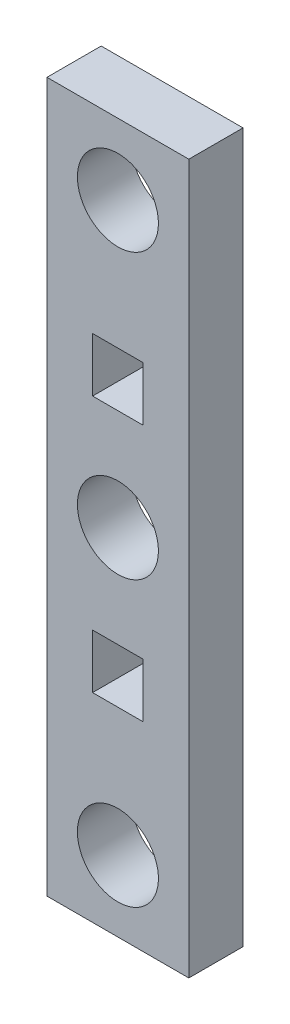
ISO-10303-21;
HEADER;
FILE_DESCRIPTION(('STEP AP214'),'2;1');
FILE_NAME('part.step','',(''),(''),'','','');
FILE_SCHEMA(('AUTOMOTIVE_DESIGN { 1 0 10303 214 1 1 1 1 }'));
ENDSEC;
DATA;
#1=APPLICATION_CONTEXT('core data for automotive mechanical design processes');
#2=APPLICATION_PROTOCOL_DEFINITION('international standard','automotive_design',2000,#1);
#3=PRODUCT_CONTEXT('',#1,'mechanical');
#4=PRODUCT('Part','Part','',(#3));
#5=PRODUCT_RELATED_PRODUCT_CATEGORY('part','',(#4));
#6=PRODUCT_DEFINITION_FORMATION('','',#4);
#7=PRODUCT_DEFINITION_CONTEXT('part definition',#1,'design');
#8=PRODUCT_DEFINITION('design','',#6,#7);
#9=PRODUCT_DEFINITION_SHAPE('','',#8);
#10=(LENGTH_UNIT() NAMED_UNIT(*) SI_UNIT(.MILLI.,.METRE.));
#11=(NAMED_UNIT(*) PLANE_ANGLE_UNIT() SI_UNIT($,.RADIAN.));
#12=(NAMED_UNIT(*) SI_UNIT($,.STERADIAN.) SOLID_ANGLE_UNIT());
#13=UNCERTAINTY_MEASURE_WITH_UNIT(LENGTH_MEASURE(1.E-05),#10,'distance_accuracy_value','');
#14=(GEOMETRIC_REPRESENTATION_CONTEXT(3) GLOBAL_UNCERTAINTY_ASSIGNED_CONTEXT((#13)) GLOBAL_UNIT_ASSIGNED_CONTEXT((#10,
#11,#12)) REPRESENTATION_CONTEXT('',''));
#15=CARTESIAN_POINT('',(0.,0.,0.));
#16=DIRECTION('',(0.,0.,1.));
#17=DIRECTION('',(1.,0.,0.));
#18=AXIS2_PLACEMENT_3D('',#15,#16,#17);
#19=CARTESIAN_POINT('',(0.,0.,5.35));
#20=DIRECTION('',(0.,0.,-1.));
#21=DIRECTION('',(-1.,0.,0.));
#22=AXIS2_PLACEMENT_3D('',#19,#20,#21);
#23=PLANE('',#22);
#24=DIRECTION('',(0.,1.,0.));
#25=VECTOR('',#24,1.);
#26=CARTESIAN_POINT('',(9.5,45.,5.35));
#27=LINE('',#26,#25);
#28=CARTESIAN_POINT('',(9.5,45.,5.35));
#29=VERTEX_POINT('',#28);
#30=CARTESIAN_POINT('',(9.5,50.35,5.35));
#31=VERTEX_POINT('',#30);
#32=EDGE_CURVE('E160',#29,#31,#27,.T.);
#33=ORIENTED_EDGE('',*,*,#32,.F.);
#34=DIRECTION('',(1.,0.,0.));
#35=VECTOR('',#34,1.);
#36=CARTESIAN_POINT('',(4.5,45.,5.35));
#37=LINE('',#36,#35);
#38=CARTESIAN_POINT('',(4.5,45.,5.35));
#39=VERTEX_POINT('',#38);
#40=EDGE_CURVE('E168',#39,#29,#37,.T.);
#41=ORIENTED_EDGE('',*,*,#40,.F.);
#42=DIRECTION('',(0.,-1.,0.));
#43=VECTOR('',#42,1.);
#44=CARTESIAN_POINT('',(4.5,45.,5.35));
#45=LINE('',#44,#43);
#46=CARTESIAN_POINT('',(4.5,50.35,5.35));
#47=VERTEX_POINT('',#46);
#48=EDGE_CURVE('E165',#47,#39,#45,.T.);
#49=ORIENTED_EDGE('',*,*,#48,.F.);
#50=DIRECTION('',(-1.,0.,0.));
#51=VECTOR('',#50,1.);
#52=CARTESIAN_POINT('',(4.5,50.35,5.35));
#53=LINE('',#52,#51);
#54=EDGE_CURVE('E162',#31,#47,#53,.T.);
#55=ORIENTED_EDGE('',*,*,#54,.F.);
#56=EDGE_LOOP('',(#33,#41,#49,#55));
#57=FACE_BOUND('',#56,.T.);
#58=DIRECTION('',(0.,-1.,0.));
#59=VECTOR('',#58,1.);
#60=CARTESIAN_POINT('',(0.,0.,5.35));
#61=LINE('',#60,#59);
#62=CARTESIAN_POINT('',(0.,70.,5.35));
#63=VERTEX_POINT('',#62);
#64=CARTESIAN_POINT('',(0.,0.,5.35));
#65=VERTEX_POINT('',#64);
#66=EDGE_CURVE('E197',#63,#65,#61,.T.);
#67=ORIENTED_EDGE('',*,*,#66,.T.);
#68=DIRECTION('',(1.,0.,0.));
#69=VECTOR('',#68,1.);
#70=CARTESIAN_POINT('',(0.,0.,5.35));
#71=LINE('',#70,#69);
#72=CARTESIAN_POINT('',(14.,0.,5.35));
#73=VERTEX_POINT('',#72);
#74=EDGE_CURVE('E200',#65,#73,#71,.T.);
#75=ORIENTED_EDGE('',*,*,#74,.T.);
#76=DIRECTION('',(0.,1.,0.));
#77=VECTOR('',#76,1.);
#78=CARTESIAN_POINT('',(14.,0.,5.35));
#79=LINE('',#78,#77);
#80=CARTESIAN_POINT('',(14.,70.,5.35));
#81=VERTEX_POINT('',#80);
#82=EDGE_CURVE('E203',#73,#81,#79,.T.);
#83=ORIENTED_EDGE('',*,*,#82,.T.);
#84=DIRECTION('',(-1.,0.,0.));
#85=VECTOR('',#84,1.);
#86=CARTESIAN_POINT('',(0.,70.,5.35));
#87=LINE('',#86,#85);
#88=EDGE_CURVE('E205',#81,#63,#87,.T.);
#89=ORIENTED_EDGE('',*,*,#88,.T.);
#90=EDGE_LOOP('',(#67,#75,#83,#89));
#91=FACE_BOUND('',#90,.T.);
#92=CARTESIAN_POINT('',(7.,63.,5.35));
#93=DIRECTION('',(0.,0.,1.));
#94=DIRECTION('',(1.,0.,0.));
#95=AXIS2_PLACEMENT_3D('',#92,#93,#94);
#96=CIRCLE('',#95,4.);
#97=CARTESIAN_POINT('',(11.,63.,5.35));
#98=VERTEX_POINT('',#97);
#99=EDGE_CURVE('E191',#98,#98,#96,.T.);
#100=ORIENTED_EDGE('',*,*,#99,.F.);
#101=EDGE_LOOP('',(#100));
#102=FACE_BOUND('',#101,.T.);
#103=DIRECTION('',(0.,-1.,0.));
#104=VECTOR('',#103,1.);
#105=CARTESIAN_POINT('',(4.5,25.,5.35));
#106=LINE('',#105,#104);
#107=CARTESIAN_POINT('',(4.5,25.,5.35));
#108=VERTEX_POINT('',#107);
#109=CARTESIAN_POINT('',(4.5,19.65,5.35));
#110=VERTEX_POINT('',#109);
#111=EDGE_CURVE('E121',#108,#110,#106,.T.);
#112=ORIENTED_EDGE('',*,*,#111,.F.);
#113=DIRECTION('',(-1.,0.,0.));
#114=VECTOR('',#113,1.);
#115=CARTESIAN_POINT('',(4.5,25.,5.35));
#116=LINE('',#115,#114);
#117=CARTESIAN_POINT('',(9.5,25.,5.35));
#118=VERTEX_POINT('',#117);
#119=EDGE_CURVE('E144',#118,#108,#116,.T.);
#120=ORIENTED_EDGE('',*,*,#119,.F.);
#121=DIRECTION('',(0.,1.,0.));
#122=VECTOR('',#121,1.);
#123=CARTESIAN_POINT('',(9.5,25.,5.35));
#124=LINE('',#123,#122);
#125=CARTESIAN_POINT('',(9.5,19.65,5.35));
#126=VERTEX_POINT('',#125);
#127=EDGE_CURVE('E142',#126,#118,#124,.T.);
#128=ORIENTED_EDGE('',*,*,#127,.F.);
#129=DIRECTION('',(1.,0.,0.));
#130=VECTOR('',#129,1.);
#131=CARTESIAN_POINT('',(4.5,19.65,5.35));
#132=LINE('',#131,#130);
#133=EDGE_CURVE('E129',#110,#126,#132,.T.);
#134=ORIENTED_EDGE('',*,*,#133,.F.);
#135=EDGE_LOOP('',(#112,#120,#128,#134));
#136=FACE_BOUND('',#135,.T.);
#137=CARTESIAN_POINT('',(7.,7.00000000000001,5.35));
#138=DIRECTION('',(0.,0.,1.));
#139=DIRECTION('',(-1.,0.,0.));
#140=AXIS2_PLACEMENT_3D('',#137,#138,#139);
#141=CIRCLE('',#140,4.);
#142=CARTESIAN_POINT('',(3.,7.00000000000001,5.35));
#143=VERTEX_POINT('',#142);
#144=EDGE_CURVE('E150',#143,#143,#141,.T.);
#145=ORIENTED_EDGE('',*,*,#144,.F.);
#146=EDGE_LOOP('',(#145));
#147=FACE_BOUND('',#146,.T.);
#148=CARTESIAN_POINT('',(7.,35.,5.35));
#149=DIRECTION('',(0.,0.,1.));
#150=DIRECTION('',(1.,0.,0.));
#151=AXIS2_PLACEMENT_3D('',#148,#149,#150);
#152=CIRCLE('',#151,4.);
#153=CARTESIAN_POINT('',(11.,35.,5.35));
#154=VERTEX_POINT('',#153);
#155=EDGE_CURVE('E283',#154,#154,#152,.T.);
#156=ORIENTED_EDGE('',*,*,#155,.F.);
#157=EDGE_LOOP('',(#156));
#158=FACE_BOUND('',#157,.T.);
#159=ADVANCED_FACE('F32',(#57,#91,#102,#136,#147,#158),#23,.F.);
#160=CARTESIAN_POINT('',(0.,0.,0.));
#161=DIRECTION('',(0.,0.,-1.));
#162=DIRECTION('',(-1.,0.,0.));
#163=AXIS2_PLACEMENT_3D('',#160,#161,#162);
#164=PLANE('',#163);
#165=CARTESIAN_POINT('',(7.,7.00000000000001,0.));
#166=DIRECTION('',(0.,0.,1.));
#167=DIRECTION('',(-1.,0.,0.));
#168=AXIS2_PLACEMENT_3D('',#165,#166,#167);
#169=CIRCLE('',#168,4.);
#170=CARTESIAN_POINT('',(3.,7.00000000000001,0.));
#171=VERTEX_POINT('',#170);
#172=EDGE_CURVE('E286',#171,#171,#169,.T.);
#173=ORIENTED_EDGE('',*,*,#172,.T.);
#174=EDGE_LOOP('',(#173));
#175=FACE_BOUND('',#174,.T.);
#176=DIRECTION('',(0.,-1.,0.));
#177=VECTOR('',#176,1.);
#178=CARTESIAN_POINT('',(0.,0.,0.));
#179=LINE('',#178,#177);
#180=CARTESIAN_POINT('',(0.,70.,0.));
#181=VERTEX_POINT('',#180);
#182=CARTESIAN_POINT('',(0.,0.,0.));
#183=VERTEX_POINT('',#182);
#184=EDGE_CURVE('E194',#181,#183,#179,.T.);
#185=ORIENTED_EDGE('',*,*,#184,.F.);
#186=DIRECTION('',(-1.,0.,0.));
#187=VECTOR('',#186,1.);
#188=CARTESIAN_POINT('',(0.,70.,0.));
#189=LINE('',#188,#187);
#190=CARTESIAN_POINT('',(14.,70.,0.));
#191=VERTEX_POINT('',#190);
#192=EDGE_CURVE('E201',#191,#181,#189,.T.);
#193=ORIENTED_EDGE('',*,*,#192,.F.);
#194=DIRECTION('',(0.,1.,0.));
#195=VECTOR('',#194,1.);
#196=CARTESIAN_POINT('',(14.,0.,0.));
#197=LINE('',#196,#195);
#198=CARTESIAN_POINT('',(14.,0.,0.));
#199=VERTEX_POINT('',#198);
#200=EDGE_CURVE('E212',#199,#191,#197,.T.);
#201=ORIENTED_EDGE('',*,*,#200,.F.);
#202=DIRECTION('',(1.,0.,0.));
#203=VECTOR('',#202,1.);
#204=CARTESIAN_POINT('',(0.,0.,0.));
#205=LINE('',#204,#203);
#206=EDGE_CURVE('E210',#183,#199,#205,.T.);
#207=ORIENTED_EDGE('',*,*,#206,.F.);
#208=EDGE_LOOP('',(#185,#193,#201,#207));
#209=FACE_BOUND('',#208,.T.);
#210=CARTESIAN_POINT('',(7.,63.,0.));
#211=DIRECTION('',(0.,0.,1.));
#212=DIRECTION('',(1.,0.,0.));
#213=AXIS2_PLACEMENT_3D('',#210,#211,#212);
#214=CIRCLE('',#213,4.);
#215=CARTESIAN_POINT('',(11.,63.,0.));
#216=VERTEX_POINT('',#215);
#217=EDGE_CURVE('E190',#216,#216,#214,.T.);
#218=ORIENTED_EDGE('',*,*,#217,.T.);
#219=EDGE_LOOP('',(#218));
#220=FACE_BOUND('',#219,.T.);
#221=DIRECTION('',(1.,0.,0.));
#222=VECTOR('',#221,1.);
#223=CARTESIAN_POINT('',(4.5,45.,0.));
#224=LINE('',#223,#222);
#225=CARTESIAN_POINT('',(4.5,45.,0.));
#226=VERTEX_POINT('',#225);
#227=CARTESIAN_POINT('',(9.5,45.,0.));
#228=VERTEX_POINT('',#227);
#229=EDGE_CURVE('E163',#226,#228,#224,.T.);
#230=ORIENTED_EDGE('',*,*,#229,.T.);
#231=DIRECTION('',(0.,1.,0.));
#232=VECTOR('',#231,1.);
#233=CARTESIAN_POINT('',(9.5,45.,0.));
#234=LINE('',#233,#232);
#235=CARTESIAN_POINT('',(9.5,50.35,0.));
#236=VERTEX_POINT('',#235);
#237=EDGE_CURVE('E137',#228,#236,#234,.T.);
#238=ORIENTED_EDGE('',*,*,#237,.T.);
#239=DIRECTION('',(-1.,0.,0.));
#240=VECTOR('',#239,1.);
#241=CARTESIAN_POINT('',(4.5,50.35,0.));
#242=LINE('',#241,#240);
#243=CARTESIAN_POINT('',(4.5,50.35,0.));
#244=VERTEX_POINT('',#243);
#245=EDGE_CURVE('E173',#236,#244,#242,.T.);
#246=ORIENTED_EDGE('',*,*,#245,.T.);
#247=DIRECTION('',(0.,-1.,0.));
#248=VECTOR('',#247,1.);
#249=CARTESIAN_POINT('',(4.5,45.,0.));
#250=LINE('',#249,#248);
#251=EDGE_CURVE('E176',#244,#226,#250,.T.);
#252=ORIENTED_EDGE('',*,*,#251,.T.);
#253=EDGE_LOOP('',(#230,#238,#246,#252));
#254=FACE_BOUND('',#253,.T.);
#255=DIRECTION('',(-1.,0.,0.));
#256=VECTOR('',#255,1.);
#257=CARTESIAN_POINT('',(4.5,25.,0.));
#258=LINE('',#257,#256);
#259=CARTESIAN_POINT('',(9.5,25.,0.));
#260=VERTEX_POINT('',#259);
#261=CARTESIAN_POINT('',(4.5,25.,0.));
#262=VERTEX_POINT('',#261);
#263=EDGE_CURVE('E130',#260,#262,#258,.T.);
#264=ORIENTED_EDGE('',*,*,#263,.T.);
#265=DIRECTION('',(0.,-1.,0.));
#266=VECTOR('',#265,1.);
#267=CARTESIAN_POINT('',(4.5,25.,0.));
#268=LINE('',#267,#266);
#269=CARTESIAN_POINT('',(4.5,19.65,0.));
#270=VERTEX_POINT('',#269);
#271=EDGE_CURVE('E55',#262,#270,#268,.T.);
#272=ORIENTED_EDGE('',*,*,#271,.T.);
#273=DIRECTION('',(1.,0.,0.));
#274=VECTOR('',#273,1.);
#275=CARTESIAN_POINT('',(4.5,19.65,0.));
#276=LINE('',#275,#274);
#277=CARTESIAN_POINT('',(9.5,19.65,0.));
#278=VERTEX_POINT('',#277);
#279=EDGE_CURVE('E136',#270,#278,#276,.T.);
#280=ORIENTED_EDGE('',*,*,#279,.T.);
#281=DIRECTION('',(0.,1.,0.));
#282=VECTOR('',#281,1.);
#283=CARTESIAN_POINT('',(9.5,25.,0.));
#284=LINE('',#283,#282);
#285=EDGE_CURVE('E152',#278,#260,#284,.T.);
#286=ORIENTED_EDGE('',*,*,#285,.T.);
#287=EDGE_LOOP('',(#264,#272,#280,#286));
#288=FACE_BOUND('',#287,.T.);
#289=CARTESIAN_POINT('',(7.,35.,0.));
#290=DIRECTION('',(0.,0.,1.));
#291=DIRECTION('',(1.,0.,0.));
#292=AXIS2_PLACEMENT_3D('',#289,#290,#291);
#293=CIRCLE('',#292,4.);
#294=CARTESIAN_POINT('',(11.,35.,0.));
#295=VERTEX_POINT('',#294);
#296=EDGE_CURVE('E281',#295,#295,#293,.T.);
#297=ORIENTED_EDGE('',*,*,#296,.T.);
#298=EDGE_LOOP('',(#297));
#299=FACE_BOUND('',#298,.T.);
#300=ADVANCED_FACE('F230',(#175,#209,#220,#254,#288,#299),#164,.T.);
#301=CARTESIAN_POINT('',(0.,0.,5.35));
#302=DIRECTION('',(1.,0.,0.));
#303=DIRECTION('',(0.,0.,-1.));
#304=AXIS2_PLACEMENT_3D('',#301,#302,#303);
#305=PLANE('',#304);
#306=ORIENTED_EDGE('',*,*,#184,.T.);
#307=DIRECTION('',(0.,0.,-1.));
#308=VECTOR('',#307,1.);
#309=CARTESIAN_POINT('',(0.,0.,5.35));
#310=LINE('',#309,#308);
#311=EDGE_CURVE('E11',#65,#183,#310,.T.);
#312=ORIENTED_EDGE('',*,*,#311,.F.);
#313=ORIENTED_EDGE('',*,*,#66,.F.);
#314=DIRECTION('',(0.,0.,-1.));
#315=VECTOR('',#314,1.);
#316=CARTESIAN_POINT('',(0.,70.,5.35));
#317=LINE('',#316,#315);
#318=EDGE_CURVE('E207',#63,#181,#317,.T.);
#319=ORIENTED_EDGE('',*,*,#318,.T.);
#320=EDGE_LOOP('',(#306,#312,#313,#319));
#321=FACE_BOUND('',#320,.T.);
#322=ADVANCED_FACE('F34',(#321),#305,.F.);
#323=CARTESIAN_POINT('',(0.,0.,5.35));
#324=DIRECTION('',(0.,1.,0.));
#325=DIRECTION('',(0.,0.,1.));
#326=AXIS2_PLACEMENT_3D('',#323,#324,#325);
#327=PLANE('',#326);
#328=ORIENTED_EDGE('',*,*,#206,.T.);
#329=DIRECTION('',(0.,0.,-1.));
#330=VECTOR('',#329,1.);
#331=CARTESIAN_POINT('',(14.,0.,5.35));
#332=LINE('',#331,#330);
#333=EDGE_CURVE('E40',#73,#199,#332,.T.);
#334=ORIENTED_EDGE('',*,*,#333,.F.);
#335=ORIENTED_EDGE('',*,*,#74,.F.);
#336=ORIENTED_EDGE('',*,*,#311,.T.);
#337=EDGE_LOOP('',(#328,#334,#335,#336));
#338=FACE_BOUND('',#337,.T.);
#339=ADVANCED_FACE('F241',(#338),#327,.F.);
#340=CARTESIAN_POINT('',(14.,0.,5.35));
#341=DIRECTION('',(-1.,0.,0.));
#342=DIRECTION('',(0.,-1.,0.));
#343=AXIS2_PLACEMENT_3D('',#340,#341,#342);
#344=PLANE('',#343);
#345=ORIENTED_EDGE('',*,*,#200,.T.);
#346=DIRECTION('',(0.,0.,-1.));
#347=VECTOR('',#346,1.);
#348=CARTESIAN_POINT('',(14.,70.,5.35));
#349=LINE('',#348,#347);
#350=EDGE_CURVE('E217',#81,#191,#349,.T.);
#351=ORIENTED_EDGE('',*,*,#350,.F.);
#352=ORIENTED_EDGE('',*,*,#82,.F.);
#353=ORIENTED_EDGE('',*,*,#333,.T.);
#354=EDGE_LOOP('',(#345,#351,#352,#353));
#355=FACE_BOUND('',#354,.T.);
#356=ADVANCED_FACE('F224',(#355),#344,.F.);
#357=CARTESIAN_POINT('',(0.,70.,5.35));
#358=DIRECTION('',(0.,-1.,0.));
#359=DIRECTION('',(0.,0.,-1.));
#360=AXIS2_PLACEMENT_3D('',#357,#358,#359);
#361=PLANE('',#360);
#362=ORIENTED_EDGE('',*,*,#192,.T.);
#363=ORIENTED_EDGE('',*,*,#318,.F.);
#364=ORIENTED_EDGE('',*,*,#88,.F.);
#365=ORIENTED_EDGE('',*,*,#350,.T.);
#366=EDGE_LOOP('',(#362,#363,#364,#365));
#367=FACE_BOUND('',#366,.T.);
#368=ADVANCED_FACE('F234',(#367),#361,.F.);
#369=CARTESIAN_POINT('',(7.,63.,5.35));
#370=DIRECTION('',(0.,0.,-1.));
#371=DIRECTION('',(-1.,0.,0.));
#372=AXIS2_PLACEMENT_3D('',#369,#370,#371);
#373=CYLINDRICAL_SURFACE('',#372,4.);
#374=ORIENTED_EDGE('',*,*,#99,.T.);
#375=EDGE_LOOP('',(#374));
#376=FACE_BOUND('',#375,.T.);
#377=ORIENTED_EDGE('',*,*,#217,.F.);
#378=EDGE_LOOP('',(#377));
#379=FACE_BOUND('',#378,.T.);
#380=ADVANCED_FACE('F258',(#376,#379),#373,.F.);
#381=CARTESIAN_POINT('',(9.5,45.,5.35));
#382=DIRECTION('',(-1.,0.,0.));
#383=DIRECTION('',(0.,0.,1.));
#384=AXIS2_PLACEMENT_3D('',#381,#382,#383);
#385=PLANE('',#384);
#386=ORIENTED_EDGE('',*,*,#237,.F.);
#387=DIRECTION('',(0.,0.,-1.));
#388=VECTOR('',#387,1.);
#389=CARTESIAN_POINT('',(9.5,45.,5.35));
#390=LINE('',#389,#388);
#391=EDGE_CURVE('E170',#29,#228,#390,.T.);
#392=ORIENTED_EDGE('',*,*,#391,.F.);
#393=ORIENTED_EDGE('',*,*,#32,.T.);
#394=DIRECTION('',(0.,0.,-1.));
#395=VECTOR('',#394,1.);
#396=CARTESIAN_POINT('',(9.5,50.35,5.35));
#397=LINE('',#396,#395);
#398=EDGE_CURVE('E187',#31,#236,#397,.T.);
#399=ORIENTED_EDGE('',*,*,#398,.T.);
#400=EDGE_LOOP('',(#386,#392,#393,#399));
#401=FACE_BOUND('',#400,.T.);
#402=ADVANCED_FACE('F265',(#401),#385,.T.);
#403=CARTESIAN_POINT('',(4.5,50.35,5.35));
#404=DIRECTION('',(0.,-1.,0.));
#405=DIRECTION('',(0.,0.,-1.));
#406=AXIS2_PLACEMENT_3D('',#403,#404,#405);
#407=PLANE('',#406);
#408=ORIENTED_EDGE('',*,*,#245,.F.);
#409=ORIENTED_EDGE('',*,*,#398,.F.);
#410=ORIENTED_EDGE('',*,*,#54,.T.);
#411=DIRECTION('',(0.,0.,-1.));
#412=VECTOR('',#411,1.);
#413=CARTESIAN_POINT('',(4.5,50.35,5.35));
#414=LINE('',#413,#412);
#415=EDGE_CURVE('E185',#47,#244,#414,.T.);
#416=ORIENTED_EDGE('',*,*,#415,.T.);
#417=EDGE_LOOP('',(#408,#409,#410,#416));
#418=FACE_BOUND('',#417,.T.);
#419=ADVANCED_FACE('F270',(#418),#407,.T.);
#420=CARTESIAN_POINT('',(4.5,45.,5.35));
#421=DIRECTION('',(1.,0.,0.));
#422=DIRECTION('',(0.,0.,-1.));
#423=AXIS2_PLACEMENT_3D('',#420,#421,#422);
#424=PLANE('',#423);
#425=ORIENTED_EDGE('',*,*,#251,.F.);
#426=ORIENTED_EDGE('',*,*,#415,.F.);
#427=ORIENTED_EDGE('',*,*,#48,.T.);
#428=DIRECTION('',(0.,0.,-1.));
#429=VECTOR('',#428,1.);
#430=CARTESIAN_POINT('',(4.5,45.,5.35));
#431=LINE('',#430,#429);
#432=EDGE_CURVE('E183',#39,#226,#431,.T.);
#433=ORIENTED_EDGE('',*,*,#432,.T.);
#434=EDGE_LOOP('',(#425,#426,#427,#433));
#435=FACE_BOUND('',#434,.T.);
#436=ADVANCED_FACE('F318',(#435),#424,.T.);
#437=CARTESIAN_POINT('',(4.5,45.,5.35));
#438=DIRECTION('',(0.,1.,0.));
#439=DIRECTION('',(0.,0.,1.));
#440=AXIS2_PLACEMENT_3D('',#437,#438,#439);
#441=PLANE('',#440);
#442=ORIENTED_EDGE('',*,*,#229,.F.);
#443=ORIENTED_EDGE('',*,*,#432,.F.);
#444=ORIENTED_EDGE('',*,*,#40,.T.);
#445=ORIENTED_EDGE('',*,*,#391,.T.);
#446=EDGE_LOOP('',(#442,#443,#444,#445));
#447=FACE_BOUND('',#446,.T.);
#448=ADVANCED_FACE('F315',(#447),#441,.T.);
#449=CARTESIAN_POINT('',(4.5,25.,5.35));
#450=DIRECTION('',(1.,0.,0.));
#451=DIRECTION('',(0.,0.,-1.));
#452=AXIS2_PLACEMENT_3D('',#449,#450,#451);
#453=PLANE('',#452);
#454=ORIENTED_EDGE('',*,*,#271,.F.);
#455=DIRECTION('',(0.,0.,-1.));
#456=VECTOR('',#455,1.);
#457=CARTESIAN_POINT('',(4.5,25.,5.35));
#458=LINE('',#457,#456);
#459=EDGE_CURVE('E125',#108,#262,#458,.T.);
#460=ORIENTED_EDGE('',*,*,#459,.F.);
#461=ORIENTED_EDGE('',*,*,#111,.T.);
#462=DIRECTION('',(0.,0.,-1.));
#463=VECTOR('',#462,1.);
#464=CARTESIAN_POINT('',(4.5,19.65,5.35));
#465=LINE('',#464,#463);
#466=EDGE_CURVE('E124',#110,#270,#465,.T.);
#467=ORIENTED_EDGE('',*,*,#466,.T.);
#468=EDGE_LOOP('',(#454,#460,#461,#467));
#469=FACE_BOUND('',#468,.T.);
#470=ADVANCED_FACE('F123',(#469),#453,.T.);
#471=CARTESIAN_POINT('',(4.5,19.65,5.35));
#472=DIRECTION('',(0.,1.,0.));
#473=DIRECTION('',(0.,0.,1.));
#474=AXIS2_PLACEMENT_3D('',#471,#472,#473);
#475=PLANE('',#474);
#476=ORIENTED_EDGE('',*,*,#279,.F.);
#477=ORIENTED_EDGE('',*,*,#466,.F.);
#478=ORIENTED_EDGE('',*,*,#133,.T.);
#479=DIRECTION('',(0.,0.,-1.));
#480=VECTOR('',#479,1.);
#481=CARTESIAN_POINT('',(9.5,19.65,5.35));
#482=LINE('',#481,#480);
#483=EDGE_CURVE('E138',#126,#278,#482,.T.);
#484=ORIENTED_EDGE('',*,*,#483,.T.);
#485=EDGE_LOOP('',(#476,#477,#478,#484));
#486=FACE_BOUND('',#485,.T.);
#487=ADVANCED_FACE('F133',(#486),#475,.T.);
#488=CARTESIAN_POINT('',(9.5,25.,5.35));
#489=DIRECTION('',(-1.,0.,0.));
#490=DIRECTION('',(0.,0.,1.));
#491=AXIS2_PLACEMENT_3D('',#488,#489,#490);
#492=PLANE('',#491);
#493=ORIENTED_EDGE('',*,*,#285,.F.);
#494=ORIENTED_EDGE('',*,*,#483,.F.);
#495=ORIENTED_EDGE('',*,*,#127,.T.);
#496=DIRECTION('',(0.,0.,-1.));
#497=VECTOR('',#496,1.);
#498=CARTESIAN_POINT('',(9.5,25.,5.35));
#499=LINE('',#498,#497);
#500=EDGE_CURVE('E47',#118,#260,#499,.T.);
#501=ORIENTED_EDGE('',*,*,#500,.T.);
#502=EDGE_LOOP('',(#493,#494,#495,#501));
#503=FACE_BOUND('',#502,.T.);
#504=ADVANCED_FACE('F305',(#503),#492,.T.);
#505=CARTESIAN_POINT('',(4.5,25.,5.35));
#506=DIRECTION('',(0.,-1.,0.));
#507=DIRECTION('',(0.,0.,-1.));
#508=AXIS2_PLACEMENT_3D('',#505,#506,#507);
#509=PLANE('',#508);
#510=ORIENTED_EDGE('',*,*,#263,.F.);
#511=ORIENTED_EDGE('',*,*,#500,.F.);
#512=ORIENTED_EDGE('',*,*,#119,.T.);
#513=ORIENTED_EDGE('',*,*,#459,.T.);
#514=EDGE_LOOP('',(#510,#511,#512,#513));
#515=FACE_BOUND('',#514,.T.);
#516=ADVANCED_FACE('F296',(#515),#509,.T.);
#517=CARTESIAN_POINT('',(7.,7.00000000000001,5.35));
#518=DIRECTION('',(0.,0.,-1.));
#519=DIRECTION('',(-1.,0.,0.));
#520=AXIS2_PLACEMENT_3D('',#517,#518,#519);
#521=CYLINDRICAL_SURFACE('',#520,4.);
#522=ORIENTED_EDGE('',*,*,#144,.T.);
#523=EDGE_LOOP('',(#522));
#524=FACE_BOUND('',#523,.T.);
#525=ORIENTED_EDGE('',*,*,#172,.F.);
#526=EDGE_LOOP('',(#525));
#527=FACE_BOUND('',#526,.T.);
#528=ADVANCED_FACE('F293',(#524,#527),#521,.F.);
#529=CARTESIAN_POINT('',(7.,35.,5.35));
#530=DIRECTION('',(0.,0.,-1.));
#531=DIRECTION('',(-1.,0.,0.));
#532=AXIS2_PLACEMENT_3D('',#529,#530,#531);
#533=CYLINDRICAL_SURFACE('',#532,4.);
#534=ORIENTED_EDGE('',*,*,#155,.T.);
#535=EDGE_LOOP('',(#534));
#536=FACE_BOUND('',#535,.T.);
#537=ORIENTED_EDGE('',*,*,#296,.F.);
#538=EDGE_LOOP('',(#537));
#539=FACE_BOUND('',#538,.T.);
#540=ADVANCED_FACE('F295',(#536,#539),#533,.F.);
#541=CLOSED_SHELL('',(#159,#300,#322,#339,#356,#368,#380,#402,#419,#436,#448,#470,#487,#504,
#516,#528,#540));
#542=MANIFOLD_SOLID_BREP('B2',#541);
#543=ADVANCED_BREP_SHAPE_REPRESENTATION('',(#18,#542),#14);
#544=SHAPE_DEFINITION_REPRESENTATION(#9,#543);
ENDSEC;
END-ISO-10303-21;
